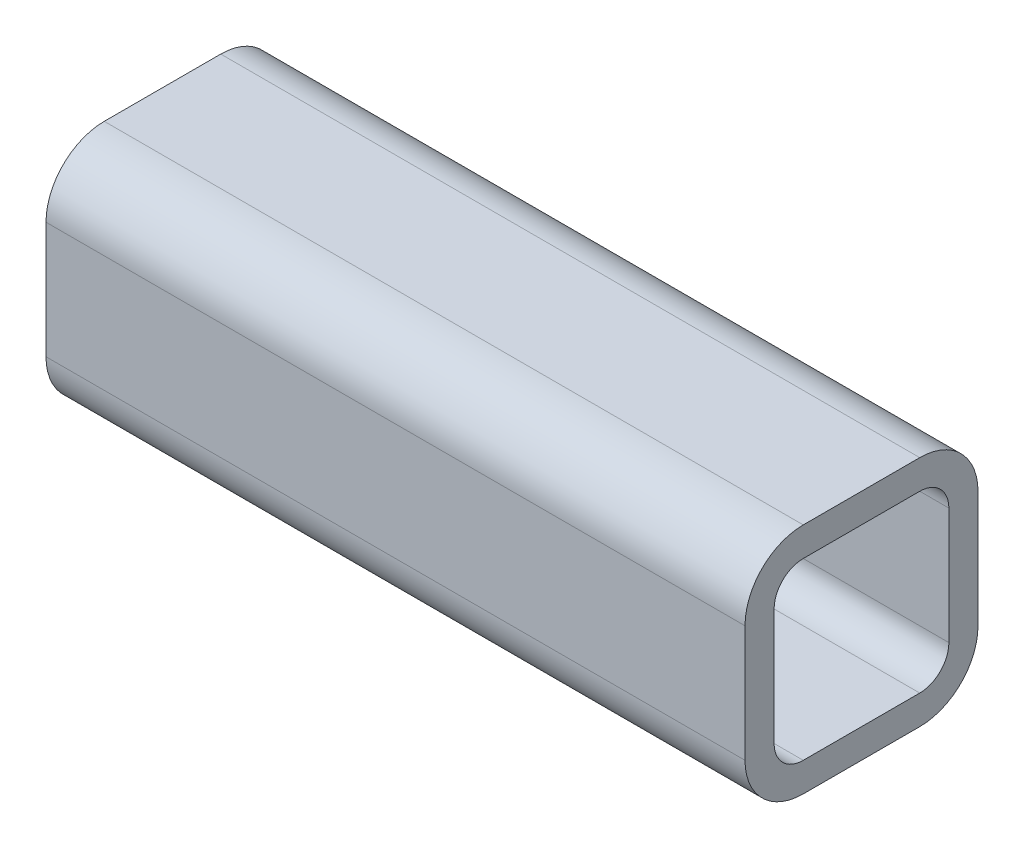
ISO-10303-21;
HEADER;
FILE_DESCRIPTION(('STEP AP214'),'2;1');
FILE_NAME('part.step','',(''),(''),'','','');
FILE_SCHEMA(('AUTOMOTIVE_DESIGN { 1 0 10303 214 1 1 1 1 }'));
ENDSEC;
DATA;
#1=APPLICATION_CONTEXT('core data for automotive mechanical design processes');
#2=APPLICATION_PROTOCOL_DEFINITION('international standard','automotive_design',2000,#1);
#3=PRODUCT_CONTEXT('',#1,'mechanical');
#4=PRODUCT('Part','Part','',(#3));
#5=PRODUCT_RELATED_PRODUCT_CATEGORY('part','',(#4));
#6=PRODUCT_DEFINITION_FORMATION('','',#4);
#7=PRODUCT_DEFINITION_CONTEXT('part definition',#1,'design');
#8=PRODUCT_DEFINITION('design','',#6,#7);
#9=PRODUCT_DEFINITION_SHAPE('','',#8);
#10=(LENGTH_UNIT() NAMED_UNIT(*) SI_UNIT(.MILLI.,.METRE.));
#11=(NAMED_UNIT(*) PLANE_ANGLE_UNIT() SI_UNIT($,.RADIAN.));
#12=(NAMED_UNIT(*) SI_UNIT($,.STERADIAN.) SOLID_ANGLE_UNIT());
#13=UNCERTAINTY_MEASURE_WITH_UNIT(LENGTH_MEASURE(1.E-05),#10,'distance_accuracy_value','');
#14=(GEOMETRIC_REPRESENTATION_CONTEXT(3) GLOBAL_UNCERTAINTY_ASSIGNED_CONTEXT((#13)) GLOBAL_UNIT_ASSIGNED_CONTEXT((#10,
#11,#12)) REPRESENTATION_CONTEXT('',''));
#15=CARTESIAN_POINT('',(0.,0.,0.));
#16=DIRECTION('',(0.,0.,1.));
#17=DIRECTION('',(1.,0.,0.));
#18=AXIS2_PLACEMENT_3D('',#15,#16,#17);
#19=CARTESIAN_POINT('',(152.4,12.7,-12.7));
#20=DIRECTION('',(-1.,0.,0.));
#21=DIRECTION('',(0.,0.,1.));
#22=AXIS2_PLACEMENT_3D('',#19,#20,#21);
#23=CYLINDRICAL_SURFACE('',#22,12.7);
#24=CARTESIAN_POINT('',(0.,12.7,-12.7));
#25=DIRECTION('',(1.,0.,0.));
#26=DIRECTION('',(0.,0.,-1.));
#27=AXIS2_PLACEMENT_3D('',#24,#25,#26);
#28=CIRCLE('',#27,12.7);
#29=CARTESIAN_POINT('',(0.,12.7,-25.4));
#30=VERTEX_POINT('',#29);
#31=CARTESIAN_POINT('',(0.,25.4,-12.7));
#32=VERTEX_POINT('',#31);
#33=EDGE_CURVE('E11',#30,#32,#28,.T.);
#34=ORIENTED_EDGE('',*,*,#33,.T.);
#35=DIRECTION('',(-1.,0.,0.));
#36=VECTOR('',#35,1.);
#37=CARTESIAN_POINT('',(152.4,25.4,-12.7));
#38=LINE('',#37,#36);
#39=CARTESIAN_POINT('',(152.4,25.4,-12.7));
#40=VERTEX_POINT('',#39);
#41=EDGE_CURVE('E39',#40,#32,#38,.T.);
#42=ORIENTED_EDGE('',*,*,#41,.F.);
#43=CARTESIAN_POINT('',(152.4,12.7,-12.7));
#44=DIRECTION('',(1.,0.,0.));
#45=DIRECTION('',(0.,0.,-1.));
#46=AXIS2_PLACEMENT_3D('',#43,#44,#45);
#47=CIRCLE('',#46,12.7);
#48=CARTESIAN_POINT('',(152.4,12.7,-25.4));
#49=VERTEX_POINT('',#48);
#50=EDGE_CURVE('E267',#49,#40,#47,.T.);
#51=ORIENTED_EDGE('',*,*,#50,.F.);
#52=DIRECTION('',(-1.,0.,0.));
#53=VECTOR('',#52,1.);
#54=CARTESIAN_POINT('',(152.4,12.7,-25.4));
#55=LINE('',#54,#53);
#56=EDGE_CURVE('E30',#49,#30,#55,.T.);
#57=ORIENTED_EDGE('',*,*,#56,.T.);
#58=EDGE_LOOP('',(#34,#42,#51,#57));
#59=FACE_BOUND('',#58,.T.);
#60=ADVANCED_FACE('F18',(#59),#23,.T.);
#61=CARTESIAN_POINT('',(152.4,25.4,-12.7));
#62=DIRECTION('',(0.,-1.,0.));
#63=DIRECTION('',(0.,0.,-1.));
#64=AXIS2_PLACEMENT_3D('',#61,#62,#63);
#65=PLANE('',#64);
#66=DIRECTION('',(0.,0.,1.));
#67=VECTOR('',#66,1.);
#68=CARTESIAN_POINT('',(0.,25.4,-12.7));
#69=LINE('',#68,#67);
#70=CARTESIAN_POINT('',(0.,25.4,12.7));
#71=VERTEX_POINT('',#70);
#72=EDGE_CURVE('E287',#32,#71,#69,.T.);
#73=ORIENTED_EDGE('',*,*,#72,.T.);
#74=DIRECTION('',(-1.,0.,0.));
#75=VECTOR('',#74,1.);
#76=CARTESIAN_POINT('',(152.4,25.4,12.7));
#77=LINE('',#76,#75);
#78=CARTESIAN_POINT('',(152.4,25.4,12.7));
#79=VERTEX_POINT('',#78);
#80=EDGE_CURVE('E291',#79,#71,#77,.T.);
#81=ORIENTED_EDGE('',*,*,#80,.F.);
#82=DIRECTION('',(0.,0.,1.));
#83=VECTOR('',#82,1.);
#84=CARTESIAN_POINT('',(152.4,25.4,-12.7));
#85=LINE('',#84,#83);
#86=EDGE_CURVE('E275',#40,#79,#85,.T.);
#87=ORIENTED_EDGE('',*,*,#86,.F.);
#88=ORIENTED_EDGE('',*,*,#41,.T.);
#89=EDGE_LOOP('',(#73,#81,#87,#88));
#90=FACE_BOUND('',#89,.T.);
#91=ADVANCED_FACE('F412',(#90),#65,.F.);
#92=CARTESIAN_POINT('',(152.4,12.7,12.7));
#93=DIRECTION('',(-1.,0.,0.));
#94=DIRECTION('',(0.,0.,1.));
#95=AXIS2_PLACEMENT_3D('',#92,#93,#94);
#96=CYLINDRICAL_SURFACE('',#95,12.7);
#97=CARTESIAN_POINT('',(0.,12.7,12.7));
#98=DIRECTION('',(1.,0.,0.));
#99=DIRECTION('',(0.,0.,-1.));
#100=AXIS2_PLACEMENT_3D('',#97,#98,#99);
#101=CIRCLE('',#100,12.7);
#102=CARTESIAN_POINT('',(0.,12.7,25.4));
#103=VERTEX_POINT('',#102);
#104=EDGE_CURVE('E298',#71,#103,#101,.T.);
#105=ORIENTED_EDGE('',*,*,#104,.T.);
#106=DIRECTION('',(-1.,0.,0.));
#107=VECTOR('',#106,1.);
#108=CARTESIAN_POINT('',(152.4,12.7,25.4));
#109=LINE('',#108,#107);
#110=CARTESIAN_POINT('',(152.4,12.7,25.4));
#111=VERTEX_POINT('',#110);
#112=EDGE_CURVE('E302',#111,#103,#109,.T.);
#113=ORIENTED_EDGE('',*,*,#112,.F.);
#114=CARTESIAN_POINT('',(152.4,12.7,12.7));
#115=DIRECTION('',(1.,0.,0.));
#116=DIRECTION('',(0.,0.,-1.));
#117=AXIS2_PLACEMENT_3D('',#114,#115,#116);
#118=CIRCLE('',#117,12.7);
#119=EDGE_CURVE('E279',#79,#111,#118,.T.);
#120=ORIENTED_EDGE('',*,*,#119,.F.);
#121=ORIENTED_EDGE('',*,*,#80,.T.);
#122=EDGE_LOOP('',(#105,#113,#120,#121));
#123=FACE_BOUND('',#122,.T.);
#124=ADVANCED_FACE('F418',(#123),#96,.T.);
#125=CARTESIAN_POINT('',(152.4,-12.7,25.4));
#126=DIRECTION('',(0.,0.,-1.));
#127=DIRECTION('',(-1.,0.,0.));
#128=AXIS2_PLACEMENT_3D('',#125,#126,#127);
#129=PLANE('',#128);
#130=DIRECTION('',(0.,-1.,0.));
#131=VECTOR('',#130,1.);
#132=CARTESIAN_POINT('',(0.,-12.7,25.4));
#133=LINE('',#132,#131);
#134=CARTESIAN_POINT('',(0.,-12.7,25.4));
#135=VERTEX_POINT('',#134);
#136=EDGE_CURVE('E305',#103,#135,#133,.T.);
#137=ORIENTED_EDGE('',*,*,#136,.T.);
#138=DIRECTION('',(-1.,0.,0.));
#139=VECTOR('',#138,1.);
#140=CARTESIAN_POINT('',(152.4,-12.7,25.4));
#141=LINE('',#140,#139);
#142=CARTESIAN_POINT('',(152.4,-12.7,25.4));
#143=VERTEX_POINT('',#142);
#144=EDGE_CURVE('E313',#143,#135,#141,.T.);
#145=ORIENTED_EDGE('',*,*,#144,.F.);
#146=DIRECTION('',(0.,-1.,0.));
#147=VECTOR('',#146,1.);
#148=CARTESIAN_POINT('',(152.4,-12.7,25.4));
#149=LINE('',#148,#147);
#150=EDGE_CURVE('E308',#111,#143,#149,.T.);
#151=ORIENTED_EDGE('',*,*,#150,.F.);
#152=ORIENTED_EDGE('',*,*,#112,.T.);
#153=EDGE_LOOP('',(#137,#145,#151,#152));
#154=FACE_BOUND('',#153,.T.);
#155=ADVANCED_FACE('F423',(#154),#129,.F.);
#156=CARTESIAN_POINT('',(152.4,-12.7,12.7));
#157=DIRECTION('',(-1.,0.,0.));
#158=DIRECTION('',(0.,0.,1.));
#159=AXIS2_PLACEMENT_3D('',#156,#157,#158);
#160=CYLINDRICAL_SURFACE('',#159,12.7);
#161=CARTESIAN_POINT('',(0.,-12.7,12.7));
#162=DIRECTION('',(1.,0.,0.));
#163=DIRECTION('',(0.,0.,-1.));
#164=AXIS2_PLACEMENT_3D('',#161,#162,#163);
#165=CIRCLE('',#164,12.7);
#166=CARTESIAN_POINT('',(0.,-25.4,12.7));
#167=VERTEX_POINT('',#166);
#168=EDGE_CURVE('E306',#135,#167,#165,.T.);
#169=ORIENTED_EDGE('',*,*,#168,.T.);
#170=DIRECTION('',(-1.,0.,0.));
#171=VECTOR('',#170,1.);
#172=CARTESIAN_POINT('',(152.4,-25.4,12.7));
#173=LINE('',#172,#171);
#174=CARTESIAN_POINT('',(152.4,-25.4,12.7));
#175=VERTEX_POINT('',#174);
#176=EDGE_CURVE('E264',#175,#167,#173,.T.);
#177=ORIENTED_EDGE('',*,*,#176,.F.);
#178=CARTESIAN_POINT('',(152.4,-12.7,12.7));
#179=DIRECTION('',(1.,0.,0.));
#180=DIRECTION('',(0.,0.,-1.));
#181=AXIS2_PLACEMENT_3D('',#178,#179,#180);
#182=CIRCLE('',#181,12.7);
#183=EDGE_CURVE('E260',#143,#175,#182,.T.);
#184=ORIENTED_EDGE('',*,*,#183,.F.);
#185=ORIENTED_EDGE('',*,*,#144,.T.);
#186=EDGE_LOOP('',(#169,#177,#184,#185));
#187=FACE_BOUND('',#186,.T.);
#188=ADVANCED_FACE('F427',(#187),#160,.T.);
#189=CARTESIAN_POINT('',(152.4,-25.4,12.7));
#190=DIRECTION('',(0.,1.,0.));
#191=DIRECTION('',(0.,0.,1.));
#192=AXIS2_PLACEMENT_3D('',#189,#190,#191);
#193=PLANE('',#192);
#194=DIRECTION('',(0.,0.,-1.));
#195=VECTOR('',#194,1.);
#196=CARTESIAN_POINT('',(0.,-25.4,12.7));
#197=LINE('',#196,#195);
#198=CARTESIAN_POINT('',(0.,-25.4,-12.7));
#199=VERTEX_POINT('',#198);
#200=EDGE_CURVE('E316',#167,#199,#197,.T.);
#201=ORIENTED_EDGE('',*,*,#200,.T.);
#202=DIRECTION('',(-1.,0.,0.));
#203=VECTOR('',#202,1.);
#204=CARTESIAN_POINT('',(152.4,-25.4,-12.7));
#205=LINE('',#204,#203);
#206=CARTESIAN_POINT('',(152.4,-25.4,-12.7));
#207=VERTEX_POINT('',#206);
#208=EDGE_CURVE('E242',#207,#199,#205,.T.);
#209=ORIENTED_EDGE('',*,*,#208,.F.);
#210=DIRECTION('',(0.,0.,-1.));
#211=VECTOR('',#210,1.);
#212=CARTESIAN_POINT('',(152.4,-25.4,12.7));
#213=LINE('',#212,#211);
#214=EDGE_CURVE('E255',#175,#207,#213,.T.);
#215=ORIENTED_EDGE('',*,*,#214,.F.);
#216=ORIENTED_EDGE('',*,*,#176,.T.);
#217=EDGE_LOOP('',(#201,#209,#215,#216));
#218=FACE_BOUND('',#217,.T.);
#219=ADVANCED_FACE('F334',(#218),#193,.F.);
#220=CARTESIAN_POINT('',(152.4,-12.7,-12.7));
#221=DIRECTION('',(-1.,0.,0.));
#222=DIRECTION('',(0.,0.,1.));
#223=AXIS2_PLACEMENT_3D('',#220,#221,#222);
#224=CYLINDRICAL_SURFACE('',#223,12.7);
#225=CARTESIAN_POINT('',(0.,-12.7,-12.7));
#226=DIRECTION('',(1.,0.,0.));
#227=DIRECTION('',(0.,0.,-1.));
#228=AXIS2_PLACEMENT_3D('',#225,#226,#227);
#229=CIRCLE('',#228,12.7);
#230=CARTESIAN_POINT('',(0.,-12.7,-25.4));
#231=VERTEX_POINT('',#230);
#232=EDGE_CURVE('E261',#199,#231,#229,.T.);
#233=ORIENTED_EDGE('',*,*,#232,.T.);
#234=DIRECTION('',(-1.,0.,0.));
#235=VECTOR('',#234,1.);
#236=CARTESIAN_POINT('',(152.4,-12.7,-25.4));
#237=LINE('',#236,#235);
#238=CARTESIAN_POINT('',(152.4,-12.7,-25.4));
#239=VERTEX_POINT('',#238);
#240=EDGE_CURVE('E265',#239,#231,#237,.T.);
#241=ORIENTED_EDGE('',*,*,#240,.F.);
#242=CARTESIAN_POINT('',(152.4,-12.7,-12.7));
#243=DIRECTION('',(1.,0.,0.));
#244=DIRECTION('',(0.,0.,-1.));
#245=AXIS2_PLACEMENT_3D('',#242,#243,#244);
#246=CIRCLE('',#245,12.7);
#247=EDGE_CURVE('E229',#207,#239,#246,.T.);
#248=ORIENTED_EDGE('',*,*,#247,.F.);
#249=ORIENTED_EDGE('',*,*,#208,.T.);
#250=EDGE_LOOP('',(#233,#241,#248,#249));
#251=FACE_BOUND('',#250,.T.);
#252=ADVANCED_FACE('F343',(#251),#224,.T.);
#253=CARTESIAN_POINT('',(152.4,12.7,12.7));
#254=DIRECTION('',(-1.,0.,0.));
#255=DIRECTION('',(0.,0.,1.));
#256=AXIS2_PLACEMENT_3D('',#253,#254,#255);
#257=CYLINDRICAL_SURFACE('',#256,6.35);
#258=CARTESIAN_POINT('',(0.,12.7,12.7));
#259=DIRECTION('',(1.,0.,0.));
#260=DIRECTION('',(0.,0.,-1.));
#261=AXIS2_PLACEMENT_3D('',#258,#259,#260);
#262=CIRCLE('',#261,6.35);
#263=CARTESIAN_POINT('',(0.,19.05,12.7));
#264=VERTEX_POINT('',#263);
#265=CARTESIAN_POINT('',(0.,12.7,19.05));
#266=VERTEX_POINT('',#265);
#267=EDGE_CURVE('E221',#264,#266,#262,.T.);
#268=ORIENTED_EDGE('',*,*,#267,.F.);
#269=DIRECTION('',(-1.,0.,0.));
#270=VECTOR('',#269,1.);
#271=CARTESIAN_POINT('',(152.4,19.05,12.7));
#272=LINE('',#271,#270);
#273=CARTESIAN_POINT('',(152.4,19.05,12.7));
#274=VERTEX_POINT('',#273);
#275=EDGE_CURVE('E233',#274,#264,#272,.T.);
#276=ORIENTED_EDGE('',*,*,#275,.F.);
#277=CARTESIAN_POINT('',(152.4,12.7,12.7));
#278=DIRECTION('',(1.,0.,0.));
#279=DIRECTION('',(0.,0.,-1.));
#280=AXIS2_PLACEMENT_3D('',#277,#278,#279);
#281=CIRCLE('',#280,6.35);
#282=CARTESIAN_POINT('',(152.4,12.7,19.05));
#283=VERTEX_POINT('',#282);
#284=EDGE_CURVE('E239',#274,#283,#281,.T.);
#285=ORIENTED_EDGE('',*,*,#284,.T.);
#286=DIRECTION('',(-1.,0.,0.));
#287=VECTOR('',#286,1.);
#288=CARTESIAN_POINT('',(152.4,12.7,19.05));
#289=LINE('',#288,#287);
#290=EDGE_CURVE('E161',#283,#266,#289,.T.);
#291=ORIENTED_EDGE('',*,*,#290,.T.);
#292=EDGE_LOOP('',(#268,#276,#285,#291));
#293=FACE_BOUND('',#292,.T.);
#294=ADVANCED_FACE('F401',(#293),#257,.F.);
#295=CARTESIAN_POINT('',(152.4,19.05,-12.7));
#296=DIRECTION('',(0.,-1.,0.));
#297=DIRECTION('',(0.,0.,-1.));
#298=AXIS2_PLACEMENT_3D('',#295,#296,#297);
#299=PLANE('',#298);
#300=DIRECTION('',(0.,0.,1.));
#301=VECTOR('',#300,1.);
#302=CARTESIAN_POINT('',(0.,19.05,-12.7));
#303=LINE('',#302,#301);
#304=CARTESIAN_POINT('',(0.,19.05,-12.7));
#305=VERTEX_POINT('',#304);
#306=EDGE_CURVE('E245',#305,#264,#303,.T.);
#307=ORIENTED_EDGE('',*,*,#306,.F.);
#308=DIRECTION('',(-1.,0.,0.));
#309=VECTOR('',#308,1.);
#310=CARTESIAN_POINT('',(152.4,19.05,-12.7));
#311=LINE('',#310,#309);
#312=CARTESIAN_POINT('',(152.4,19.05,-12.7));
#313=VERTEX_POINT('',#312);
#314=EDGE_CURVE('E187',#313,#305,#311,.T.);
#315=ORIENTED_EDGE('',*,*,#314,.F.);
#316=DIRECTION('',(0.,0.,1.));
#317=VECTOR('',#316,1.);
#318=CARTESIAN_POINT('',(152.4,19.05,-12.7));
#319=LINE('',#318,#317);
#320=EDGE_CURVE('E237',#313,#274,#319,.T.);
#321=ORIENTED_EDGE('',*,*,#320,.T.);
#322=ORIENTED_EDGE('',*,*,#275,.T.);
#323=EDGE_LOOP('',(#307,#315,#321,#322));
#324=FACE_BOUND('',#323,.T.);
#325=ADVANCED_FACE('F399',(#324),#299,.T.);
#326=CARTESIAN_POINT('',(152.4,12.7,-12.7));
#327=DIRECTION('',(-1.,0.,0.));
#328=DIRECTION('',(0.,0.,1.));
#329=AXIS2_PLACEMENT_3D('',#326,#327,#328);
#330=CYLINDRICAL_SURFACE('',#329,6.35);
#331=CARTESIAN_POINT('',(0.,12.7,-12.7));
#332=DIRECTION('',(1.,0.,0.));
#333=DIRECTION('',(0.,0.,-1.));
#334=AXIS2_PLACEMENT_3D('',#331,#332,#333);
#335=CIRCLE('',#334,6.35);
#336=CARTESIAN_POINT('',(0.,12.7,-19.05));
#337=VERTEX_POINT('',#336);
#338=EDGE_CURVE('E249',#337,#305,#335,.T.);
#339=ORIENTED_EDGE('',*,*,#338,.F.);
#340=DIRECTION('',(-1.,0.,0.));
#341=VECTOR('',#340,1.);
#342=CARTESIAN_POINT('',(152.4,12.7,-19.05));
#343=LINE('',#342,#341);
#344=CARTESIAN_POINT('',(152.4,12.7,-19.05));
#345=VERTEX_POINT('',#344);
#346=EDGE_CURVE('E188',#345,#337,#343,.T.);
#347=ORIENTED_EDGE('',*,*,#346,.F.);
#348=CARTESIAN_POINT('',(152.4,12.7,-12.7));
#349=DIRECTION('',(1.,0.,0.));
#350=DIRECTION('',(0.,0.,-1.));
#351=AXIS2_PLACEMENT_3D('',#348,#349,#350);
#352=CIRCLE('',#351,6.35);
#353=EDGE_CURVE('E238',#345,#313,#352,.T.);
#354=ORIENTED_EDGE('',*,*,#353,.T.);
#355=ORIENTED_EDGE('',*,*,#314,.T.);
#356=EDGE_LOOP('',(#339,#347,#354,#355));
#357=FACE_BOUND('',#356,.T.);
#358=ADVANCED_FACE('F387',(#357),#330,.F.);
#359=CARTESIAN_POINT('',(152.4,12.7,-19.05));
#360=DIRECTION('',(0.,0.,1.));
#361=DIRECTION('',(1.,0.,0.));
#362=AXIS2_PLACEMENT_3D('',#359,#360,#361);
#363=PLANE('',#362);
#364=DIRECTION('',(0.,1.,0.));
#365=VECTOR('',#364,1.);
#366=CARTESIAN_POINT('',(0.,12.7,-19.05));
#367=LINE('',#366,#365);
#368=CARTESIAN_POINT('',(0.,-12.7,-19.05));
#369=VERTEX_POINT('',#368);
#370=EDGE_CURVE('E195',#369,#337,#367,.T.);
#371=ORIENTED_EDGE('',*,*,#370,.F.);
#372=DIRECTION('',(-1.,0.,0.));
#373=VECTOR('',#372,1.);
#374=CARTESIAN_POINT('',(152.4,-12.7,-19.05));
#375=LINE('',#374,#373);
#376=CARTESIAN_POINT('',(152.4,-12.7,-19.05));
#377=VERTEX_POINT('',#376);
#378=EDGE_CURVE('E189',#377,#369,#375,.T.);
#379=ORIENTED_EDGE('',*,*,#378,.F.);
#380=DIRECTION('',(0.,1.,0.));
#381=VECTOR('',#380,1.);
#382=CARTESIAN_POINT('',(152.4,12.7,-19.05));
#383=LINE('',#382,#381);
#384=EDGE_CURVE('E181',#377,#345,#383,.T.);
#385=ORIENTED_EDGE('',*,*,#384,.T.);
#386=ORIENTED_EDGE('',*,*,#346,.T.);
#387=EDGE_LOOP('',(#371,#379,#385,#386));
#388=FACE_BOUND('',#387,.T.);
#389=ADVANCED_FACE('F385',(#388),#363,.T.);
#390=CARTESIAN_POINT('',(152.4,-12.7,-12.7));
#391=DIRECTION('',(-1.,0.,0.));
#392=DIRECTION('',(0.,0.,1.));
#393=AXIS2_PLACEMENT_3D('',#390,#391,#392);
#394=CYLINDRICAL_SURFACE('',#393,6.35);
#395=CARTESIAN_POINT('',(0.,-12.7,-12.7));
#396=DIRECTION('',(1.,0.,0.));
#397=DIRECTION('',(0.,0.,-1.));
#398=AXIS2_PLACEMENT_3D('',#395,#396,#397);
#399=CIRCLE('',#398,6.35);
#400=CARTESIAN_POINT('',(0.,-19.05,-12.7));
#401=VERTEX_POINT('',#400);
#402=EDGE_CURVE('E190',#401,#369,#399,.T.);
#403=ORIENTED_EDGE('',*,*,#402,.F.);
#404=DIRECTION('',(-1.,0.,0.));
#405=VECTOR('',#404,1.);
#406=CARTESIAN_POINT('',(152.4,-19.05,-12.7));
#407=LINE('',#406,#405);
#408=CARTESIAN_POINT('',(152.4,-19.05,-12.7));
#409=VERTEX_POINT('',#408);
#410=EDGE_CURVE('E156',#409,#401,#407,.T.);
#411=ORIENTED_EDGE('',*,*,#410,.F.);
#412=CARTESIAN_POINT('',(152.4,-12.7,-12.7));
#413=DIRECTION('',(1.,0.,0.));
#414=DIRECTION('',(0.,0.,-1.));
#415=AXIS2_PLACEMENT_3D('',#412,#413,#414);
#416=CIRCLE('',#415,6.35);
#417=EDGE_CURVE('E199',#409,#377,#416,.T.);
#418=ORIENTED_EDGE('',*,*,#417,.T.);
#419=ORIENTED_EDGE('',*,*,#378,.T.);
#420=EDGE_LOOP('',(#403,#411,#418,#419));
#421=FACE_BOUND('',#420,.T.);
#422=ADVANCED_FACE('F376',(#421),#394,.F.);
#423=CARTESIAN_POINT('',(152.4,-19.05,12.7));
#424=DIRECTION('',(0.,1.,0.));
#425=DIRECTION('',(0.,0.,1.));
#426=AXIS2_PLACEMENT_3D('',#423,#424,#425);
#427=PLANE('',#426);
#428=DIRECTION('',(0.,0.,-1.));
#429=VECTOR('',#428,1.);
#430=CARTESIAN_POINT('',(0.,-19.05,12.7));
#431=LINE('',#430,#429);
#432=CARTESIAN_POINT('',(0.,-19.05,12.7));
#433=VERTEX_POINT('',#432);
#434=EDGE_CURVE('E194',#433,#401,#431,.T.);
#435=ORIENTED_EDGE('',*,*,#434,.F.);
#436=DIRECTION('',(-1.,0.,0.));
#437=VECTOR('',#436,1.);
#438=CARTESIAN_POINT('',(152.4,-19.05,12.7));
#439=LINE('',#438,#437);
#440=CARTESIAN_POINT('',(152.4,-19.05,12.7));
#441=VERTEX_POINT('',#440);
#442=EDGE_CURVE('E157',#441,#433,#439,.T.);
#443=ORIENTED_EDGE('',*,*,#442,.F.);
#444=DIRECTION('',(0.,0.,-1.));
#445=VECTOR('',#444,1.);
#446=CARTESIAN_POINT('',(152.4,-19.05,12.7));
#447=LINE('',#446,#445);
#448=EDGE_CURVE('E154',#441,#409,#447,.T.);
#449=ORIENTED_EDGE('',*,*,#448,.T.);
#450=ORIENTED_EDGE('',*,*,#410,.T.);
#451=EDGE_LOOP('',(#435,#443,#449,#450));
#452=FACE_BOUND('',#451,.T.);
#453=ADVANCED_FACE('F382',(#452),#427,.T.);
#454=CARTESIAN_POINT('',(152.4,-12.7,12.7));
#455=DIRECTION('',(-1.,0.,0.));
#456=DIRECTION('',(0.,0.,1.));
#457=AXIS2_PLACEMENT_3D('',#454,#455,#456);
#458=CYLINDRICAL_SURFACE('',#457,6.35);
#459=CARTESIAN_POINT('',(0.,-12.7,12.7));
#460=DIRECTION('',(1.,0.,0.));
#461=DIRECTION('',(0.,0.,-1.));
#462=AXIS2_PLACEMENT_3D('',#459,#460,#461);
#463=CIRCLE('',#462,6.35);
#464=CARTESIAN_POINT('',(0.,-12.7,19.05));
#465=VERTEX_POINT('',#464);
#466=EDGE_CURVE('E131',#465,#433,#463,.T.);
#467=ORIENTED_EDGE('',*,*,#466,.F.);
#468=DIRECTION('',(-1.,0.,0.));
#469=VECTOR('',#468,1.);
#470=CARTESIAN_POINT('',(152.4,-12.7,19.05));
#471=LINE('',#470,#469);
#472=CARTESIAN_POINT('',(152.4,-12.7,19.05));
#473=VERTEX_POINT('',#472);
#474=EDGE_CURVE('E134',#473,#465,#471,.T.);
#475=ORIENTED_EDGE('',*,*,#474,.F.);
#476=CARTESIAN_POINT('',(152.4,-12.7,12.7));
#477=DIRECTION('',(1.,0.,0.));
#478=DIRECTION('',(0.,0.,-1.));
#479=AXIS2_PLACEMENT_3D('',#476,#477,#478);
#480=CIRCLE('',#479,6.35);
#481=EDGE_CURVE('E137',#473,#441,#480,.T.);
#482=ORIENTED_EDGE('',*,*,#481,.T.);
#483=ORIENTED_EDGE('',*,*,#442,.T.);
#484=EDGE_LOOP('',(#467,#475,#482,#483));
#485=FACE_BOUND('',#484,.T.);
#486=ADVANCED_FACE('F136',(#485),#458,.F.);
#487=CARTESIAN_POINT('',(152.4,-12.7,19.05));
#488=DIRECTION('',(0.,0.,-1.));
#489=DIRECTION('',(-1.,0.,0.));
#490=AXIS2_PLACEMENT_3D('',#487,#488,#489);
#491=PLANE('',#490);
#492=DIRECTION('',(0.,-1.,0.));
#493=VECTOR('',#492,1.);
#494=CARTESIAN_POINT('',(0.,-12.7,19.05));
#495=LINE('',#494,#493);
#496=EDGE_CURVE('E171',#266,#465,#495,.T.);
#497=ORIENTED_EDGE('',*,*,#496,.F.);
#498=ORIENTED_EDGE('',*,*,#290,.F.);
#499=DIRECTION('',(0.,-1.,0.));
#500=VECTOR('',#499,1.);
#501=CARTESIAN_POINT('',(152.4,-12.7,19.05));
#502=LINE('',#501,#500);
#503=EDGE_CURVE('E143',#283,#473,#502,.T.);
#504=ORIENTED_EDGE('',*,*,#503,.T.);
#505=ORIENTED_EDGE('',*,*,#474,.T.);
#506=EDGE_LOOP('',(#497,#498,#504,#505));
#507=FACE_BOUND('',#506,.T.);
#508=ADVANCED_FACE('F159',(#507),#491,.T.);
#509=CARTESIAN_POINT('',(152.4,12.7,-25.4));
#510=DIRECTION('',(0.,0.,1.));
#511=DIRECTION('',(1.,0.,0.));
#512=AXIS2_PLACEMENT_3D('',#509,#510,#511);
#513=PLANE('',#512);
#514=DIRECTION('',(0.,1.,0.));
#515=VECTOR('',#514,1.);
#516=CARTESIAN_POINT('',(0.,12.7,-25.4));
#517=LINE('',#516,#515);
#518=EDGE_CURVE('E144',#231,#30,#517,.T.);
#519=ORIENTED_EDGE('',*,*,#518,.T.);
#520=ORIENTED_EDGE('',*,*,#56,.F.);
#521=DIRECTION('',(0.,1.,0.));
#522=VECTOR('',#521,1.);
#523=CARTESIAN_POINT('',(152.4,12.7,-25.4));
#524=LINE('',#523,#522);
#525=EDGE_CURVE('E22',#239,#49,#524,.T.);
#526=ORIENTED_EDGE('',*,*,#525,.F.);
#527=ORIENTED_EDGE('',*,*,#240,.T.);
#528=EDGE_LOOP('',(#519,#520,#526,#527));
#529=FACE_BOUND('',#528,.T.);
#530=ADVANCED_FACE('F504',(#529),#513,.F.);
#531=CARTESIAN_POINT('',(152.4,12.7,-12.7));
#532=DIRECTION('',(1.,0.,0.));
#533=DIRECTION('',(0.,0.,-1.));
#534=AXIS2_PLACEMENT_3D('',#531,#532,#533);
#535=PLANE('',#534);
#536=ORIENTED_EDGE('',*,*,#284,.F.);
#537=ORIENTED_EDGE('',*,*,#320,.F.);
#538=ORIENTED_EDGE('',*,*,#353,.F.);
#539=ORIENTED_EDGE('',*,*,#384,.F.);
#540=ORIENTED_EDGE('',*,*,#417,.F.);
#541=ORIENTED_EDGE('',*,*,#448,.F.);
#542=ORIENTED_EDGE('',*,*,#481,.F.);
#543=ORIENTED_EDGE('',*,*,#503,.F.);
#544=EDGE_LOOP('',(#536,#537,#538,#539,#540,#541,#542,#543));
#545=FACE_BOUND('',#544,.T.);
#546=ORIENTED_EDGE('',*,*,#50,.T.);
#547=ORIENTED_EDGE('',*,*,#86,.T.);
#548=ORIENTED_EDGE('',*,*,#119,.T.);
#549=ORIENTED_EDGE('',*,*,#150,.T.);
#550=ORIENTED_EDGE('',*,*,#183,.T.);
#551=ORIENTED_EDGE('',*,*,#214,.T.);
#552=ORIENTED_EDGE('',*,*,#247,.T.);
#553=ORIENTED_EDGE('',*,*,#525,.T.);
#554=EDGE_LOOP('',(#546,#547,#548,#549,#550,#551,#552,#553));
#555=FACE_BOUND('',#554,.T.);
#556=ADVANCED_FACE('F150',(#545,#555),#535,.T.);
#557=CARTESIAN_POINT('',(0.,12.7,-12.7));
#558=DIRECTION('',(1.,0.,0.));
#559=DIRECTION('',(0.,0.,-1.));
#560=AXIS2_PLACEMENT_3D('',#557,#558,#559);
#561=PLANE('',#560);
#562=ORIENTED_EDGE('',*,*,#267,.T.);
#563=ORIENTED_EDGE('',*,*,#496,.T.);
#564=ORIENTED_EDGE('',*,*,#466,.T.);
#565=ORIENTED_EDGE('',*,*,#434,.T.);
#566=ORIENTED_EDGE('',*,*,#402,.T.);
#567=ORIENTED_EDGE('',*,*,#370,.T.);
#568=ORIENTED_EDGE('',*,*,#338,.T.);
#569=ORIENTED_EDGE('',*,*,#306,.T.);
#570=EDGE_LOOP('',(#562,#563,#564,#565,#566,#567,#568,#569));
#571=FACE_BOUND('',#570,.T.);
#572=ORIENTED_EDGE('',*,*,#33,.F.);
#573=ORIENTED_EDGE('',*,*,#518,.F.);
#574=ORIENTED_EDGE('',*,*,#232,.F.);
#575=ORIENTED_EDGE('',*,*,#200,.F.);
#576=ORIENTED_EDGE('',*,*,#168,.F.);
#577=ORIENTED_EDGE('',*,*,#136,.F.);
#578=ORIENTED_EDGE('',*,*,#104,.F.);
#579=ORIENTED_EDGE('',*,*,#72,.F.);
#580=EDGE_LOOP('',(#572,#573,#574,#575,#576,#577,#578,#579));
#581=FACE_BOUND('',#580,.T.);
#582=ADVANCED_FACE('F20',(#571,#581),#561,.F.);
#583=CLOSED_SHELL('',(#60,#91,#124,#155,#188,#219,#252,#294,#325,#358,#389,#422,#453,#486,#508,
#530,#556,#582));
#584=MANIFOLD_SOLID_BREP('B1',#583);
#585=ADVANCED_BREP_SHAPE_REPRESENTATION('',(#18,#584),#14);
#586=SHAPE_DEFINITION_REPRESENTATION(#9,#585);
ENDSEC;
END-ISO-10303-21;
